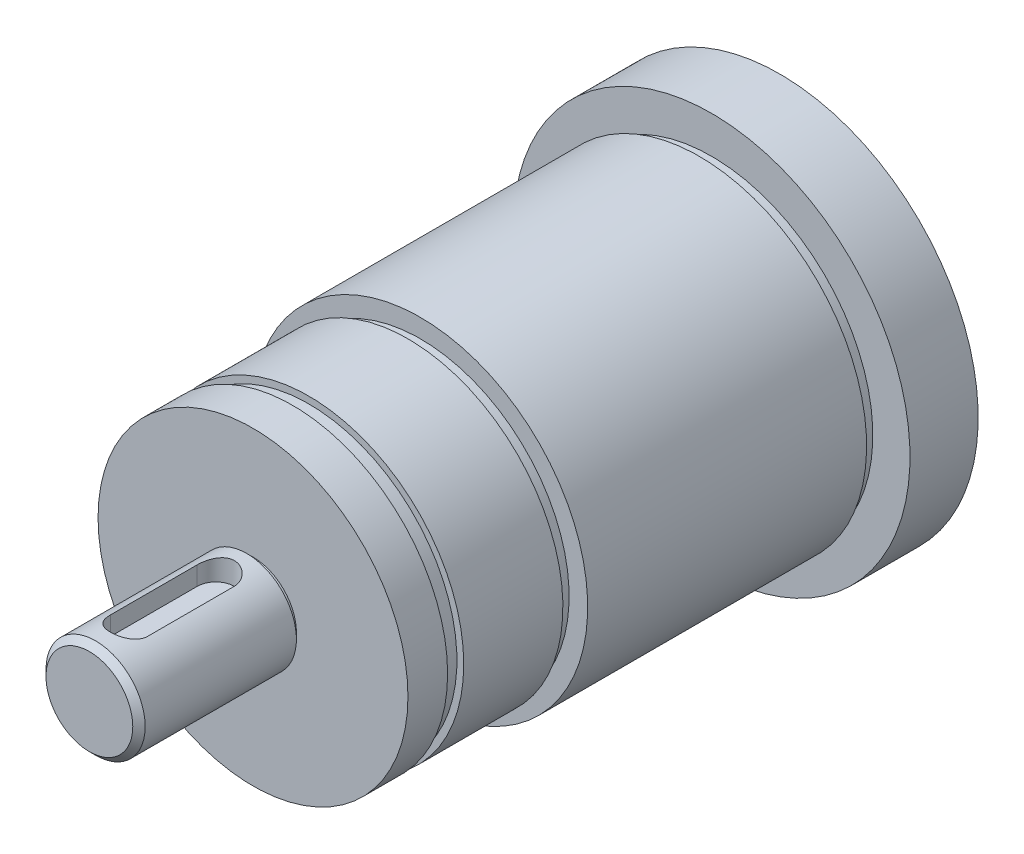
ISO-10303-21;
HEADER;
FILE_DESCRIPTION(('STEP AP214'),'2;1');
FILE_NAME('part.step','',(''),(''),'','','');
FILE_SCHEMA(('AUTOMOTIVE_DESIGN { 1 0 10303 214 1 1 1 1 }'));
ENDSEC;
DATA;
#1=APPLICATION_CONTEXT('core data for automotive mechanical design processes');
#2=APPLICATION_PROTOCOL_DEFINITION('international standard','automotive_design',2000,#1);
#3=PRODUCT_CONTEXT('',#1,'mechanical');
#4=PRODUCT('Part','Part','',(#3));
#5=PRODUCT_RELATED_PRODUCT_CATEGORY('part','',(#4));
#6=PRODUCT_DEFINITION_FORMATION('','',#4);
#7=PRODUCT_DEFINITION_CONTEXT('part definition',#1,'design');
#8=PRODUCT_DEFINITION('design','',#6,#7);
#9=PRODUCT_DEFINITION_SHAPE('','',#8);
#10=(LENGTH_UNIT() NAMED_UNIT(*) SI_UNIT(.MILLI.,.METRE.));
#11=(NAMED_UNIT(*) PLANE_ANGLE_UNIT() SI_UNIT($,.RADIAN.));
#12=(NAMED_UNIT(*) SI_UNIT($,.STERADIAN.) SOLID_ANGLE_UNIT());
#13=UNCERTAINTY_MEASURE_WITH_UNIT(LENGTH_MEASURE(1.E-05),#10,'distance_accuracy_value','');
#14=(GEOMETRIC_REPRESENTATION_CONTEXT(3) GLOBAL_UNCERTAINTY_ASSIGNED_CONTEXT((#13)) GLOBAL_UNIT_ASSIGNED_CONTEXT((#10,
#11,#12)) REPRESENTATION_CONTEXT('',''));
#15=CARTESIAN_POINT('',(0.,0.,0.));
#16=DIRECTION('',(0.,0.,1.));
#17=DIRECTION('',(1.,0.,0.));
#18=AXIS2_PLACEMENT_3D('',#15,#16,#17);
#19=CARTESIAN_POINT('',(0.,0.,0.));
#20=DIRECTION('',(0.,0.,-1.));
#21=DIRECTION('',(-1.,0.,0.));
#22=AXIS2_PLACEMENT_3D('',#19,#20,#21);
#23=CYLINDRICAL_SURFACE('',#22,12.5);
#24=CARTESIAN_POINT('',(0.,0.,38.));
#25=DIRECTION('',(0.,0.,-1.));
#26=DIRECTION('',(-1.,0.,0.));
#27=AXIS2_PLACEMENT_3D('',#24,#25,#26);
#28=CIRCLE('',#27,12.5);
#29=CARTESIAN_POINT('',(-12.5,0.,38.));
#30=VERTEX_POINT('',#29);
#31=EDGE_CURVE('E137',#30,#30,#28,.T.);
#32=ORIENTED_EDGE('',*,*,#31,.T.);
#33=EDGE_LOOP('',(#32));
#34=FACE_BOUND('',#33,.T.);
#35=CARTESIAN_POINT('',(0.,0.,30.));
#36=DIRECTION('',(0.,0.,1.));
#37=DIRECTION('',(0.,-1.,0.));
#38=AXIS2_PLACEMENT_3D('',#35,#36,#37);
#39=CIRCLE('',#38,12.5);
#40=CARTESIAN_POINT('',(0.,-12.5,30.));
#41=VERTEX_POINT('',#40);
#42=EDGE_CURVE('E288',#41,#41,#39,.T.);
#43=ORIENTED_EDGE('',*,*,#42,.T.);
#44=EDGE_LOOP('',(#43));
#45=FACE_BOUND('',#44,.T.);
#46=ADVANCED_FACE('F41',(#34,#45),#23,.T.);
#47=CARTESIAN_POINT('',(0.,0.,0.));
#48=DIRECTION('',(0.,0.,-1.));
#49=DIRECTION('',(-1.,0.,0.));
#50=AXIS2_PLACEMENT_3D('',#47,#48,#49);
#51=CYLINDRICAL_SURFACE('',#50,4.);
#52=CARTESIAN_POINT('',(1.5,3.70809924354783,45.5));
#53=CARTESIAN_POINT('',(1.50000149729856,3.70809443619347,45.4594074669704));
#54=CARTESIAN_POINT('',(1.49835118206537,3.70876663375751,45.4188360707122));
#55=CARTESIAN_POINT('',(1.49177905295192,3.71141673218274,45.3380154612727));
#56=CARTESIAN_POINT('',(1.48685833749724,3.7133941946446,45.2977661445068));
#57=CARTESIAN_POINT('',(1.46729482367934,3.72118975606221,45.1782327842748));
#58=CARTESIAN_POINT('',(1.44784998767983,3.72887188404209,45.0998003397728));
#59=CARTESIAN_POINT('',(1.39690233043372,3.74825217997877,44.9476324814849));
#60=CARTESIAN_POINT('',(1.36540966903062,3.7599469632381,44.8738931709592));
#61=CARTESIAN_POINT('',(1.29134097725473,3.7860238820009,44.7326664799387));
#62=CARTESIAN_POINT('',(1.24875587557702,3.80040821426565,44.6651842779876));
#63=CARTESIAN_POINT('',(1.15146603872016,3.83103589828726,44.5351080800593));
#64=CARTESIAN_POINT('',(1.09630269892843,3.84733374054252,44.4728699856818));
#65=CARTESIAN_POINT('',(0.976394584974248,3.8794978206844,44.3582764069826));
#66=CARTESIAN_POINT('',(0.911647960429693,3.8953639745168,44.3059228356596));
#67=CARTESIAN_POINT('',(0.771693719740028,3.92552893891844,44.2108597857464));
#68=CARTESIAN_POINT('',(0.69620496875862,3.93975598379754,44.1685393993163));
#69=CARTESIAN_POINT('',(0.538553622304916,3.96438035322527,44.0973480889171));
#70=CARTESIAN_POINT('',(0.456393528521798,3.97477910532575,44.0684721505131));
#71=CARTESIAN_POINT('',(0.291490050670581,3.99018690464435,44.0262422811784));
#72=CARTESIAN_POINT('',(0.208924649211902,3.99540906103972,44.012272615696));
#73=CARTESIAN_POINT('',(0.042465838580881,4.00064014015321,43.998278802068));
#74=CARTESIAN_POINT('',(-0.0414271540462172,4.00065066686691,43.9982503631981));
#75=CARTESIAN_POINT('',(-0.203744100069414,3.99559264174045,44.011781806229));
#76=CARTESIAN_POINT('',(-0.28223328288309,3.99077535168083,44.0246694752074));
#77=CARTESIAN_POINT('',(-0.435840275995121,3.97693262269583,44.0625362711122));
#78=CARTESIAN_POINT('',(-0.510957894586936,3.96790694481372,44.0875160846463));
#79=CARTESIAN_POINT('',(-0.656988917196582,3.94637770601049,44.1491703925958));
#80=CARTESIAN_POINT('',(-0.727825198012183,3.93382542785068,44.1860098409234));
#81=CARTESIAN_POINT('',(-0.862486444375069,3.90651314175191,44.2701920375731));
#82=CARTESIAN_POINT('',(-0.926309119580092,3.89175241632297,44.3175382017873));
#83=CARTESIAN_POINT('',(-1.04908600084313,3.86052643048222,44.4246231314911));
#84=CARTESIAN_POINT('',(-1.10753779261244,3.84401196825707,44.484924384335));
#85=CARTESIAN_POINT('',(-1.21369725159035,3.81182684214318,44.6145841343778));
#86=CARTESIAN_POINT('',(-1.26140069584828,3.79615651174147,44.6839461746474));
#87=CARTESIAN_POINT('',(-1.34567998313248,3.7671186794103,44.8317580284138));
#88=CARTESIAN_POINT('',(-1.38197861969245,3.75381153298453,44.9103784056676));
#89=CARTESIAN_POINT('',(-1.44059114536973,3.73171449181344,45.0732063218419));
#90=CARTESIAN_POINT('',(-1.46292853893353,3.72291700934123,45.157404204933));
#91=CARTESIAN_POINT('',(-1.48519272209728,3.7140622685257,45.2853810176478));
#92=CARTESIAN_POINT('',(-1.49074028414002,3.71183476402566,45.3281023295206));
#93=CARTESIAN_POINT('',(-1.49814308997677,3.70885093143241,45.4138740688717));
#94=CARTESIAN_POINT('',(-1.50000176547338,3.70809323601797,45.4569241530294));
#95=CARTESIAN_POINT('',(-1.5,3.70809924354783,45.5));
#96=B_SPLINE_CURVE_WITH_KNOTS('',3,(#52,#53,#54,#55,#56,#57,#58,#59,#60,#61,#62,#63,#64,#65,#66,
#67,#68,#69,#70,#71,#72,#73,#74,#75,#76,#77,#78,#79,#80,#81,#82,#83,#84,#85,#86,#87,#88,#89,#90,
#91,#92,#93,#94,#95),.UNSPECIFIED.,.F.,.F.,(4,2,2,2,2,2,2,2,2,2,2,2,2,2,2,2,2,2,2,2,2,4),(0.,
0.121697465666185,0.243354077586416,0.485593064591345,0.727628221922013,0.969861938431286,
1.22298027419407,1.47614754705134,1.73793539440997,1.9996255232324,2.25002925199202,
2.5003559133568,2.73829765644058,2.97625291175452,3.21767225141682,3.45917019544674,
3.7147799395163,3.97048993642582,4.23200510445914,4.4930788043249,4.62233004062783,
4.75146098044212),.UNSPECIFIED.);
#97=CARTESIAN_POINT('',(1.5,3.70809924354783,45.5));
#98=VERTEX_POINT('',#97);
#99=CARTESIAN_POINT('',(-1.5,3.70809924354783,45.5));
#100=VERTEX_POINT('',#99);
#101=EDGE_CURVE('E162',#98,#100,#96,.T.);
#102=ORIENTED_EDGE('',*,*,#101,.F.);
#103=DIRECTION('',(0.,0.,-1.));
#104=VECTOR('',#103,1.);
#105=CARTESIAN_POINT('',(1.5,3.70809924354783,0.));
#106=LINE('',#105,#104);
#107=CARTESIAN_POINT('',(1.5,3.70809924354783,52.5));
#108=VERTEX_POINT('',#107);
#109=EDGE_CURVE('E198',#108,#98,#106,.T.);
#110=ORIENTED_EDGE('',*,*,#109,.F.);
#111=CARTESIAN_POINT('',(-1.5,3.70809924354783,52.5));
#112=CARTESIAN_POINT('',(-1.50000149729856,3.70809443619347,52.5405925330296));
#113=CARTESIAN_POINT('',(-1.49835118206537,3.70876663375751,52.5811639292878));
#114=CARTESIAN_POINT('',(-1.49177905295192,3.71141673218274,52.6619845387273));
#115=CARTESIAN_POINT('',(-1.48685833749724,3.7133941946446,52.7022338554932));
#116=CARTESIAN_POINT('',(-1.46729482367934,3.72118975606221,52.8217672157252));
#117=CARTESIAN_POINT('',(-1.44784998767984,3.72887188404209,52.9001996602272));
#118=CARTESIAN_POINT('',(-1.39690233043372,3.74825217997877,53.0523675185151));
#119=CARTESIAN_POINT('',(-1.36540966903062,3.7599469632381,53.1261068290407));
#120=CARTESIAN_POINT('',(-1.29134097725473,3.7860238820009,53.2673335200613));
#121=CARTESIAN_POINT('',(-1.24875587557702,3.80040821426565,53.3348157220124));
#122=CARTESIAN_POINT('',(-1.15146603872016,3.83103589828726,53.4648919199407));
#123=CARTESIAN_POINT('',(-1.09630269892843,3.84733374054252,53.5271300143182));
#124=CARTESIAN_POINT('',(-0.976394584974256,3.8794978206844,53.6417235930174));
#125=CARTESIAN_POINT('',(-0.911647960429701,3.8953639745168,53.6940771643404));
#126=CARTESIAN_POINT('',(-0.771693719740036,3.92552893891844,53.7891402142536));
#127=CARTESIAN_POINT('',(-0.696204968758628,3.93975598379754,53.8314606006837));
#128=CARTESIAN_POINT('',(-0.538553622304924,3.96438035322527,53.9026519110829));
#129=CARTESIAN_POINT('',(-0.456393528521806,3.97477910532575,53.9315278494869));
#130=CARTESIAN_POINT('',(-0.291490050670589,3.99018690464435,53.9737577188216));
#131=CARTESIAN_POINT('',(-0.20892464921191,3.99540906103972,53.987727384304));
#132=CARTESIAN_POINT('',(-0.0424658385808886,4.00064014015321,54.001721197932));
#133=CARTESIAN_POINT('',(0.0414271540462096,4.00065066686691,54.0017496368019));
#134=CARTESIAN_POINT('',(0.203744100069407,3.99559264174045,53.988218193771));
#135=CARTESIAN_POINT('',(0.282233282883083,3.99077535168083,53.9753305247926));
#136=CARTESIAN_POINT('',(0.435840275995115,3.97693262269583,53.9374637288878));
#137=CARTESIAN_POINT('',(0.51095789458693,3.96790694481372,53.9124839153537));
#138=CARTESIAN_POINT('',(0.656988917196577,3.94637770601049,53.8508296074042));
#139=CARTESIAN_POINT('',(0.727825198012178,3.93382542785068,53.8139901590766));
#140=CARTESIAN_POINT('',(0.862486444375064,3.90651314175191,53.7298079624269));
#141=CARTESIAN_POINT('',(0.926309119580087,3.89175241632297,53.6824617982127));
#142=CARTESIAN_POINT('',(1.04908600084313,3.86052643048222,53.5753768685089));
#143=CARTESIAN_POINT('',(1.10753779261244,3.84401196825707,53.515075615665));
#144=CARTESIAN_POINT('',(1.21369725159035,3.81182684214318,53.3854158656222));
#145=CARTESIAN_POINT('',(1.26140069584828,3.79615651174147,53.3160538253526));
#146=CARTESIAN_POINT('',(1.34567998313248,3.7671186794103,53.1682419715862));
#147=CARTESIAN_POINT('',(1.38197861969246,3.75381153298453,53.0896215943324));
#148=CARTESIAN_POINT('',(1.44059114536973,3.73171449181344,52.9267936781581));
#149=CARTESIAN_POINT('',(1.46292853893353,3.72291700934123,52.842595795067));
#150=CARTESIAN_POINT('',(1.48519272209728,3.7140622685257,52.7146189823522));
#151=CARTESIAN_POINT('',(1.49074028414002,3.71183476402566,52.6718976704794));
#152=CARTESIAN_POINT('',(1.49814308997677,3.70885093143241,52.5861259311283));
#153=CARTESIAN_POINT('',(1.50000176547338,3.70809323601797,52.5430758469706));
#154=CARTESIAN_POINT('',(1.5,3.70809924354783,52.5));
#155=B_SPLINE_CURVE_WITH_KNOTS('',3,(#111,#112,#113,#114,#115,#116,#117,#118,#119,#120,#121,
#122,#123,#124,#125,#126,#127,#128,#129,#130,#131,#132,#133,#134,#135,#136,#137,#138,#139,#140,
#141,#142,#143,#144,#145,#146,#147,#148,#149,#150,#151,#152,#153,#154),.UNSPECIFIED.,.F.,.F.,(4,
2,2,2,2,2,2,2,2,2,2,2,2,2,2,2,2,2,2,2,2,4),(0.,0.121697465666185,0.243354077586416,
0.485593064591345,0.72762822192202,0.969861938431285,1.22298027419407,1.47614754705134,
1.73793539440997,1.9996255232324,2.25002925199202,2.5003559133568,2.73829765644058,
2.97625291175452,3.21767225141682,3.45917019544673,3.7147799395163,3.97048993642583,
4.23200510445916,4.49307880432491,4.62233004062784,4.75146098044213),.UNSPECIFIED.);
#156=CARTESIAN_POINT('',(-1.5,3.70809924354783,52.5));
#157=VERTEX_POINT('',#156);
#158=EDGE_CURVE('E64',#157,#108,#155,.T.);
#159=ORIENTED_EDGE('',*,*,#158,.F.);
#160=DIRECTION('',(0.,0.,-1.));
#161=VECTOR('',#160,1.);
#162=CARTESIAN_POINT('',(-1.5,3.70809924354783,0.));
#163=LINE('',#162,#161);
#164=EDGE_CURVE('E173',#100,#157,#163,.F.);
#165=ORIENTED_EDGE('',*,*,#164,.F.);
#166=EDGE_LOOP('',(#102,#110,#159,#165));
#167=FACE_BOUND('',#166,.T.);
#168=CARTESIAN_POINT('',(0.,0.,55.2));
#169=DIRECTION('',(0.,0.,1.));
#170=DIRECTION('',(1.,0.,0.));
#171=AXIS2_PLACEMENT_3D('',#168,#169,#170);
#172=CIRCLE('',#171,4.);
#173=CARTESIAN_POINT('',(4.,0.,55.2));
#174=VERTEX_POINT('',#173);
#175=EDGE_CURVE('E160',#174,#174,#172,.F.);
#176=ORIENTED_EDGE('',*,*,#175,.T.);
#177=EDGE_LOOP('',(#176));
#178=FACE_BOUND('',#177,.T.);
#179=CARTESIAN_POINT('',(0.,0.,43.));
#180=DIRECTION('',(0.,0.,-1.));
#181=DIRECTION('',(-1.,0.,0.));
#182=AXIS2_PLACEMENT_3D('',#179,#180,#181);
#183=CIRCLE('',#182,4.);
#184=CARTESIAN_POINT('',(-4.,0.,43.));
#185=VERTEX_POINT('',#184);
#186=EDGE_CURVE('E111',#185,#185,#183,.T.);
#187=ORIENTED_EDGE('',*,*,#186,.F.);
#188=EDGE_LOOP('',(#187));
#189=FACE_BOUND('',#188,.T.);
#190=CARTESIAN_POINT('',(0.,-4.,51.95));
#191=CARTESIAN_POINT('',(-0.0684391851745466,-3.99999965877989,51.9500004465876));
#192=CARTESIAN_POINT('',(-0.13688305250286,-3.9982269498484,51.9556392269444));
#193=CARTESIAN_POINT('',(-0.271769209588449,-3.99132894088806,51.9779862415392));
#194=CARTESIAN_POINT('',(-0.338211042725907,-3.98620288199859,51.9946969813644));
#195=CARTESIAN_POINT('',(-0.467128543650807,-3.97315815697909,52.0385693711957));
#196=CARTESIAN_POINT('',(-0.529610176985804,-3.96524381499025,52.065714844653));
#197=CARTESIAN_POINT('',(-0.64913480234646,-3.94743969161092,52.1296173176783));
#198=CARTESIAN_POINT('',(-0.706176935444886,-3.93754959899905,52.1663758317806));
#199=CARTESIAN_POINT('',(-0.814965334952282,-3.91650213740282,52.2496559920174));
#200=CARTESIAN_POINT('',(-0.866520028156661,-3.90531715926988,52.2964208850611));
#201=CARTESIAN_POINT('',(-0.961197382036994,-3.88310046374208,52.3978683924135));
#202=CARTESIAN_POINT('',(-1.0043184728987,-3.87206877523457,52.4525524774945));
#203=CARTESIAN_POINT('',(-1.08194336483113,-3.85111144698172,52.5699445638081));
#204=CARTESIAN_POINT('',(-1.11620784150129,-3.84121988301795,52.6328174775272));
#205=CARTESIAN_POINT('',(-1.17359741076671,-3.82407801799234,52.7637923149819));
#206=CARTESIAN_POINT('',(-1.19672543771945,-3.81682702128688,52.8318928557939));
#207=CARTESIAN_POINT('',(-1.23048459930034,-3.806076069845,52.9692280774521));
#208=CARTESIAN_POINT('',(-1.24147110007865,-3.80246972929508,53.0383668436389));
#209=CARTESIAN_POINT('',(-1.25174555036988,-3.7991005514095,53.1775931189119));
#210=CARTESIAN_POINT('',(-1.25103660995772,-3.79933669227334,53.2476803708217));
#211=CARTESIAN_POINT('',(-1.23821824732739,-3.80353189075438,53.383874460269));
#212=CARTESIAN_POINT('',(-1.22656057869383,-3.80734341745948,53.4500291258616));
#213=CARTESIAN_POINT('',(-1.19290813355626,-3.81802025652489,53.5793921565374));
#214=CARTESIAN_POINT('',(-1.17091225844551,-3.82488589343114,53.6426002077088));
#215=CARTESIAN_POINT('',(-1.11688874681277,-3.84101044014296,53.7653519444326));
#216=CARTESIAN_POINT('',(-1.08471925662082,-3.85030284660824,53.824828610692));
#217=CARTESIAN_POINT('',(-1.01136020737848,-3.87021856580069,53.9376877678791));
#218=CARTESIAN_POINT('',(-0.970168305215773,-3.88084222394551,53.9910686702537));
#219=CARTESIAN_POINT('',(-0.877716954182126,-3.90281527800493,54.092774943417));
#220=CARTESIAN_POINT('',(-0.826084570592821,-3.91417569605695,54.1407595577797));
#221=CARTESIAN_POINT('',(-0.715364408095535,-3.9359157075958,54.2274718935797));
#222=CARTESIAN_POINT('',(-0.656276077349023,-3.94629522838372,54.2661989292192));
#223=CARTESIAN_POINT('',(-0.531664610465455,-3.96501294890191,54.3335276886013));
#224=CARTESIAN_POINT('',(-0.466094906919279,-3.97333460648208,54.362048135464));
#225=CARTESIAN_POINT('',(-0.330767977782643,-3.98687955828554,54.4075530008516));
#226=CARTESIAN_POINT('',(-0.261012030724607,-3.99210379325151,54.4245409222384));
#227=CARTESIAN_POINT('',(-0.122185157290343,-3.99871389395014,54.445918042579));
#228=CARTESIAN_POINT('',(-0.0531918487888409,-4.00024022895439,54.4507685435935));
#229=CARTESIAN_POINT('',(0.0846303057325862,-3.9996979973098,54.4490337733627));
#230=CARTESIAN_POINT('',(0.153459174306507,-3.99762995581124,54.4424501726774));
#231=CARTESIAN_POINT('',(0.287219332975853,-3.99022363769771,54.4184044073936));
#232=CARTESIAN_POINT('',(0.352204978420949,-3.98496793110724,54.4012167323875));
#233=CARTESIAN_POINT('',(0.478351928861366,-3.97180121379252,54.3567856476333));
#234=CARTESIAN_POINT('',(0.539512760449017,-3.96388987514203,54.3295409959751));
#235=CARTESIAN_POINT('',(0.657932406672232,-3.94598542759567,54.2650267834512));
#236=CARTESIAN_POINT('',(0.715059739787954,-3.93594626818209,54.2275290125028));
#237=CARTESIAN_POINT('',(0.822365850960095,-3.91493410002887,54.143846789883));
#238=CARTESIAN_POINT('',(0.872542738043336,-3.90396083845861,54.0976599822569));
#239=CARTESIAN_POINT('',(0.966587462919657,-3.88176994885247,53.9957411099463));
#240=CARTESIAN_POINT('',(1.01012652339774,-3.87055986714445,53.9397033362547));
#241=CARTESIAN_POINT('',(1.08721250244909,-3.84961947087601,53.8208733836293));
#242=CARTESIAN_POINT('',(1.12075957972524,-3.83988913281399,53.7580813119956));
#243=CARTESIAN_POINT('',(1.17670083481141,-3.82311782360753,53.6276548271141));
#244=CARTESIAN_POINT('',(1.19913819558886,-3.81606646468026,53.5600403504953));
#245=CARTESIAN_POINT('',(1.23222894320964,-3.80551170941212,53.4217275066762));
#246=CARTESIAN_POINT('',(1.2428868141461,-3.80200696302675,53.3510303236287));
#247=CARTESIAN_POINT('',(1.2517940615754,-3.79908292712494,53.2119959124458));
#248=CARTESIAN_POINT('',(1.25058279621957,-3.79948604683076,53.1436965461871));
#249=CARTESIAN_POINT('',(1.23708818129474,-3.80390090472382,53.0083254150808));
#250=CARTESIAN_POINT('',(1.22480534822559,-3.80791247457319,52.941253593116));
#251=CARTESIAN_POINT('',(1.18987729913378,-3.81896814158112,52.8112059603982));
#252=CARTESIAN_POINT('',(1.16738642405944,-3.82596698183474,52.748184558904));
#253=CARTESIAN_POINT('',(1.11280227335064,-3.84219704261347,52.6267595864686));
#254=CARTESIAN_POINT('',(1.08070704444254,-3.85142871716521,52.5683569579223));
#255=CARTESIAN_POINT('',(1.00635675013475,-3.8715348703158,52.4553540295594));
#256=CARTESIAN_POINT('',(0.963753335241274,-3.88245948922441,52.4009918704996));
#257=CARTESIAN_POINT('',(0.870208996404849,-3.90448998821726,52.3000136718882));
#258=CARTESIAN_POINT('',(0.819265842344404,-3.91559591606794,52.253399711009));
#259=CARTESIAN_POINT('',(0.708486662823334,-3.93717271952328,52.167717461637));
#260=CARTESIAN_POINT('',(0.648414574487382,-3.94761101730634,52.12894526355));
#261=CARTESIAN_POINT('',(0.522279138013657,-3.96626769296916,52.0621010848606));
#262=CARTESIAN_POINT('',(0.456218157795453,-3.97448694315832,52.0340248978582));
#263=CARTESIAN_POINT('',(0.325747635373981,-3.98720650733461,51.9914086323915));
#264=CARTESIAN_POINT('',(0.261670337112548,-3.99196240806139,51.9759251326947));
#265=CARTESIAN_POINT('',(0.131729895440248,-3.99835900340486,51.9552216400323));
#266=CARTESIAN_POINT('',(0.0658671161396752,-4.00000032839643,51.949999570196));
#267=CARTESIAN_POINT('',(0.,-4.,51.95));
#268=B_SPLINE_CURVE_WITH_KNOTS('',3,(#190,#191,#192,#193,#194,#195,#196,#197,#198,#199,#200,
#201,#202,#203,#204,#205,#206,#207,#208,#209,#210,#211,#212,#213,#214,#215,#216,#217,#218,#219,
#220,#221,#222,#223,#224,#225,#226,#227,#228,#229,#230,#231,#232,#233,#234,#235,#236,#237,#238,
#239,#240,#241,#242,#243,#244,#245,#246,#247,#248,#249,#250,#251,#252,#253,#254,#255,#256,#257,
#258,#259,#260,#261,#262,#263,#264,#265,#266,#267),.UNSPECIFIED.,.T.,.F.,(4,2,2,2,2,2,2,2,2,2,2,
2,2,2,2,2,2,2,2,2,2,2,2,2,2,2,2,2,2,2,2,2,2,2,2,2,2,2,4),(0.,0.20507544943251,0.410197323349067,
0.615002479202438,0.819839921558392,1.03037822195158,1.24095567431276,1.45673771247493,
1.67246286279527,1.88169150167211,2.09086450295139,2.2917691742217,2.49269519979063,
2.69655642720546,2.90047066010359,3.113667472796,3.32688007413303,3.54175460689771,
3.75656384494554,3.96307568548238,4.16955735649363,4.37090626722872,4.572280050345,
4.77856324738343,4.98490245709259,5.19941778713141,5.41392970983713,5.62760115751033,
5.84119123892431,6.04512203476054,6.24904331751085,6.44997913396672,6.65095584330175,
6.85979514006362,7.06869037373341,7.28440668126413,7.50003806666338,7.69744636651542,
7.89481470763049),.UNSPECIFIED.);
#269=CARTESIAN_POINT('',(0.,-4.,51.95));
#270=VERTEX_POINT('',#269);
#271=EDGE_CURVE('E196',#270,#270,#268,.T.);
#272=ORIENTED_EDGE('',*,*,#271,.T.);
#273=EDGE_LOOP('',(#272));
#274=FACE_BOUND('',#273,.T.);
#275=ADVANCED_FACE('F171',(#167,#178,#189,#274),#51,.T.);
#276=CARTESIAN_POINT('',(0.,12.5,38.));
#277=DIRECTION('',(0.,0.,1.));
#278=DIRECTION('',(1.,0.,0.));
#279=AXIS2_PLACEMENT_3D('',#276,#277,#278);
#280=PLANE('',#279);
#281=CARTESIAN_POINT('',(0.,0.,38.));
#282=DIRECTION('',(0.,0.,-1.));
#283=DIRECTION('',(-1.,0.,0.));
#284=AXIS2_PLACEMENT_3D('',#281,#282,#283);
#285=CIRCLE('',#284,11.95);
#286=CARTESIAN_POINT('',(-11.95,0.,38.));
#287=VERTEX_POINT('',#286);
#288=EDGE_CURVE('E136',#287,#287,#285,.T.);
#289=ORIENTED_EDGE('',*,*,#288,.T.);
#290=EDGE_LOOP('',(#289));
#291=FACE_BOUND('',#290,.T.);
#292=ORIENTED_EDGE('',*,*,#31,.F.);
#293=EDGE_LOOP('',(#292));
#294=FACE_BOUND('',#293,.T.);
#295=ADVANCED_FACE('F231',(#291,#294),#280,.T.);
#296=CARTESIAN_POINT('',(0.,0.,0.));
#297=DIRECTION('',(0.,0.,-1.));
#298=DIRECTION('',(-1.,0.,0.));
#299=AXIS2_PLACEMENT_3D('',#296,#297,#298);
#300=CYLINDRICAL_SURFACE('',#299,11.95);
#301=CARTESIAN_POINT('',(0.,0.,39.3));
#302=DIRECTION('',(0.,0.,-1.));
#303=DIRECTION('',(-1.,0.,0.));
#304=AXIS2_PLACEMENT_3D('',#301,#302,#303);
#305=CIRCLE('',#304,11.95);
#306=CARTESIAN_POINT('',(-11.95,0.,39.3));
#307=VERTEX_POINT('',#306);
#308=EDGE_CURVE('E131',#307,#307,#305,.T.);
#309=ORIENTED_EDGE('',*,*,#308,.T.);
#310=EDGE_LOOP('',(#309));
#311=FACE_BOUND('',#310,.T.);
#312=ORIENTED_EDGE('',*,*,#288,.F.);
#313=EDGE_LOOP('',(#312));
#314=FACE_BOUND('',#313,.T.);
#315=ADVANCED_FACE('F355',(#311,#314),#300,.T.);
#316=CARTESIAN_POINT('',(0.,11.95,39.3));
#317=DIRECTION('',(0.,0.,-1.));
#318=DIRECTION('',(-1.,0.,0.));
#319=AXIS2_PLACEMENT_3D('',#316,#317,#318);
#320=PLANE('',#319);
#321=CARTESIAN_POINT('',(0.,0.,39.3));
#322=DIRECTION('',(0.,0.,-1.));
#323=DIRECTION('',(-1.,0.,0.));
#324=AXIS2_PLACEMENT_3D('',#321,#322,#323);
#325=CIRCLE('',#324,12.5);
#326=CARTESIAN_POINT('',(-12.5,0.,39.3));
#327=VERTEX_POINT('',#326);
#328=EDGE_CURVE('E128',#327,#327,#325,.T.);
#329=ORIENTED_EDGE('',*,*,#328,.T.);
#330=EDGE_LOOP('',(#329));
#331=FACE_BOUND('',#330,.T.);
#332=ORIENTED_EDGE('',*,*,#308,.F.);
#333=EDGE_LOOP('',(#332));
#334=FACE_BOUND('',#333,.T.);
#335=ADVANCED_FACE('F363',(#331,#334),#320,.T.);
#336=CARTESIAN_POINT('',(0.,0.,0.));
#337=DIRECTION('',(0.,0.,-1.));
#338=DIRECTION('',(-1.,0.,0.));
#339=AXIS2_PLACEMENT_3D('',#336,#337,#338);
#340=CYLINDRICAL_SURFACE('',#339,12.5);
#341=CARTESIAN_POINT('',(0.,0.,42.5));
#342=DIRECTION('',(0.,0.,-1.));
#343=DIRECTION('',(-1.,0.,0.));
#344=AXIS2_PLACEMENT_3D('',#341,#342,#343);
#345=CIRCLE('',#344,12.5);
#346=CARTESIAN_POINT('',(-12.5,0.,42.5));
#347=VERTEX_POINT('',#346);
#348=EDGE_CURVE('E130',#347,#347,#345,.T.);
#349=ORIENTED_EDGE('',*,*,#348,.T.);
#350=EDGE_LOOP('',(#349));
#351=FACE_BOUND('',#350,.T.);
#352=ORIENTED_EDGE('',*,*,#328,.F.);
#353=EDGE_LOOP('',(#352));
#354=FACE_BOUND('',#353,.T.);
#355=ADVANCED_FACE('F367',(#351,#354),#340,.T.);
#356=CARTESIAN_POINT('',(0.,12.5,42.5));
#357=DIRECTION('',(0.,0.,1.));
#358=DIRECTION('',(1.,0.,0.));
#359=AXIS2_PLACEMENT_3D('',#356,#357,#358);
#360=PLANE('',#359);
#361=CARTESIAN_POINT('',(0.,0.,42.5));
#362=DIRECTION('',(0.,0.,-1.));
#363=DIRECTION('',(-1.,0.,0.));
#364=AXIS2_PLACEMENT_3D('',#361,#362,#363);
#365=CIRCLE('',#364,3.5);
#366=CARTESIAN_POINT('',(-3.5,0.,42.5));
#367=VERTEX_POINT('',#366);
#368=EDGE_CURVE('E122',#367,#367,#365,.T.);
#369=ORIENTED_EDGE('',*,*,#368,.T.);
#370=EDGE_LOOP('',(#369));
#371=FACE_BOUND('',#370,.T.);
#372=ORIENTED_EDGE('',*,*,#348,.F.);
#373=EDGE_LOOP('',(#372));
#374=FACE_BOUND('',#373,.T.);
#375=ADVANCED_FACE('F379',(#371,#374),#360,.T.);
#376=CARTESIAN_POINT('',(0.,0.,0.));
#377=DIRECTION('',(0.,0.,-1.));
#378=DIRECTION('',(-1.,0.,0.));
#379=AXIS2_PLACEMENT_3D('',#376,#377,#378);
#380=CYLINDRICAL_SURFACE('',#379,3.5);
#381=CARTESIAN_POINT('',(0.,0.,43.));
#382=DIRECTION('',(0.,0.,-1.));
#383=DIRECTION('',(-1.,0.,0.));
#384=AXIS2_PLACEMENT_3D('',#381,#382,#383);
#385=CIRCLE('',#384,3.5);
#386=CARTESIAN_POINT('',(-3.5,0.,43.));
#387=VERTEX_POINT('',#386);
#388=EDGE_CURVE('E121',#387,#387,#385,.T.);
#389=ORIENTED_EDGE('',*,*,#388,.T.);
#390=EDGE_LOOP('',(#389));
#391=FACE_BOUND('',#390,.T.);
#392=ORIENTED_EDGE('',*,*,#368,.F.);
#393=EDGE_LOOP('',(#392));
#394=FACE_BOUND('',#393,.T.);
#395=ADVANCED_FACE('F388',(#391,#394),#380,.T.);
#396=CARTESIAN_POINT('',(0.,3.5,43.));
#397=DIRECTION('',(0.,0.,-1.));
#398=DIRECTION('',(-1.,0.,0.));
#399=AXIS2_PLACEMENT_3D('',#396,#397,#398);
#400=PLANE('',#399);
#401=ORIENTED_EDGE('',*,*,#186,.T.);
#402=EDGE_LOOP('',(#401));
#403=FACE_BOUND('',#402,.T.);
#404=ORIENTED_EDGE('',*,*,#388,.F.);
#405=EDGE_LOOP('',(#404));
#406=FACE_BOUND('',#405,.T.);
#407=ADVANCED_FACE('F275',(#403,#406),#400,.T.);
#408=CARTESIAN_POINT('',(0.,4.,55.7));
#409=DIRECTION('',(0.,0.,1.));
#410=DIRECTION('',(1.,0.,0.));
#411=AXIS2_PLACEMENT_3D('',#408,#409,#410);
#412=PLANE('',#411);
#413=CARTESIAN_POINT('',(0.,0.,55.7));
#414=DIRECTION('',(0.,0.,1.));
#415=DIRECTION('',(1.,0.,0.));
#416=AXIS2_PLACEMENT_3D('',#413,#414,#415);
#417=CIRCLE('',#416,3.50000000000001);
#418=CARTESIAN_POINT('',(3.50000000000001,0.,55.7));
#419=VERTEX_POINT('',#418);
#420=EDGE_CURVE('E159',#419,#419,#417,.T.);
#421=ORIENTED_EDGE('',*,*,#420,.T.);
#422=EDGE_LOOP('',(#421));
#423=FACE_BOUND('',#422,.T.);
#424=ADVANCED_FACE('F187',(#423),#412,.T.);
#425=CARTESIAN_POINT('',(0.,0.,55.2));
#426=DIRECTION('',(0.,0.,-1.));
#427=DIRECTION('',(-1.,0.,0.));
#428=AXIS2_PLACEMENT_3D('',#425,#426,#427);
#429=CONICAL_SURFACE('',#428,4.,0.785398163397448);
#430=ORIENTED_EDGE('',*,*,#420,.F.);
#431=EDGE_LOOP('',(#430));
#432=FACE_BOUND('',#431,.T.);
#433=ORIENTED_EDGE('',*,*,#175,.F.);
#434=EDGE_LOOP('',(#433));
#435=FACE_BOUND('',#434,.T.);
#436=ADVANCED_FACE('F189',(#432,#435),#429,.T.);
#437=CARTESIAN_POINT('',(0.,2.2,52.5));
#438=DIRECTION('',(0.,1.,0.));
#439=DIRECTION('',(0.,0.,1.));
#440=AXIS2_PLACEMENT_3D('',#437,#438,#439);
#441=CYLINDRICAL_SURFACE('',#440,1.5);
#442=DIRECTION('',(0.,1.,0.));
#443=VECTOR('',#442,1.);
#444=CARTESIAN_POINT('',(-1.5,2.2,52.5));
#445=LINE('',#444,#443);
#446=CARTESIAN_POINT('',(-1.5,2.2,52.5));
#447=VERTEX_POINT('',#446);
#448=EDGE_CURVE('E115',#447,#157,#445,.T.);
#449=ORIENTED_EDGE('',*,*,#448,.T.);
#450=ORIENTED_EDGE('',*,*,#158,.T.);
#451=DIRECTION('',(0.,1.,0.));
#452=VECTOR('',#451,1.);
#453=CARTESIAN_POINT('',(1.5,2.2,52.5));
#454=LINE('',#453,#452);
#455=CARTESIAN_POINT('',(1.5,2.2,52.5));
#456=VERTEX_POINT('',#455);
#457=EDGE_CURVE('E60',#456,#108,#454,.T.);
#458=ORIENTED_EDGE('',*,*,#457,.F.);
#459=CARTESIAN_POINT('',(0.,2.2,52.5));
#460=DIRECTION('',(0.,1.,0.));
#461=DIRECTION('',(0.,0.,1.));
#462=AXIS2_PLACEMENT_3D('',#459,#460,#461);
#463=CIRCLE('',#462,1.5);
#464=EDGE_CURVE('E87',#447,#456,#463,.T.);
#465=ORIENTED_EDGE('',*,*,#464,.F.);
#466=EDGE_LOOP('',(#449,#450,#458,#465));
#467=FACE_BOUND('',#466,.T.);
#468=ADVANCED_FACE('F84',(#467),#441,.F.);
#469=CARTESIAN_POINT('',(-1.5,2.2,52.5));
#470=DIRECTION('',(-1.,0.,0.));
#471=DIRECTION('',(0.,0.,1.));
#472=AXIS2_PLACEMENT_3D('',#469,#470,#471);
#473=PLANE('',#472);
#474=ORIENTED_EDGE('',*,*,#164,.T.);
#475=ORIENTED_EDGE('',*,*,#448,.F.);
#476=DIRECTION('',(0.,0.,1.));
#477=VECTOR('',#476,1.);
#478=CARTESIAN_POINT('',(-1.5,2.2,52.5));
#479=LINE('',#478,#477);
#480=CARTESIAN_POINT('',(-1.5,2.2,45.5));
#481=VERTEX_POINT('',#480);
#482=EDGE_CURVE('E89',#481,#447,#479,.T.);
#483=ORIENTED_EDGE('',*,*,#482,.F.);
#484=DIRECTION('',(0.,1.,0.));
#485=VECTOR('',#484,1.);
#486=CARTESIAN_POINT('',(-1.5,2.2,45.5));
#487=LINE('',#486,#485);
#488=EDGE_CURVE('E113',#481,#100,#487,.T.);
#489=ORIENTED_EDGE('',*,*,#488,.T.);
#490=EDGE_LOOP('',(#474,#475,#483,#489));
#491=FACE_BOUND('',#490,.T.);
#492=ADVANCED_FACE('F185',(#491),#473,.F.);
#493=CARTESIAN_POINT('',(0.,2.2,45.5));
#494=DIRECTION('',(0.,1.,0.));
#495=DIRECTION('',(0.,0.,1.));
#496=AXIS2_PLACEMENT_3D('',#493,#494,#495);
#497=CYLINDRICAL_SURFACE('',#496,1.5);
#498=DIRECTION('',(0.,1.,0.));
#499=VECTOR('',#498,1.);
#500=CARTESIAN_POINT('',(1.5,2.2,45.5));
#501=LINE('',#500,#499);
#502=CARTESIAN_POINT('',(1.5,2.2,45.5));
#503=VERTEX_POINT('',#502);
#504=EDGE_CURVE('E90',#503,#98,#501,.T.);
#505=ORIENTED_EDGE('',*,*,#504,.T.);
#506=ORIENTED_EDGE('',*,*,#101,.T.);
#507=ORIENTED_EDGE('',*,*,#488,.F.);
#508=CARTESIAN_POINT('',(0.,2.2,45.5));
#509=DIRECTION('',(0.,1.,0.));
#510=DIRECTION('',(0.,0.,1.));
#511=AXIS2_PLACEMENT_3D('',#508,#509,#510);
#512=CIRCLE('',#511,1.5);
#513=EDGE_CURVE('E97',#503,#481,#512,.T.);
#514=ORIENTED_EDGE('',*,*,#513,.F.);
#515=EDGE_LOOP('',(#505,#506,#507,#514));
#516=FACE_BOUND('',#515,.T.);
#517=ADVANCED_FACE('F180',(#516),#497,.F.);
#518=CARTESIAN_POINT('',(1.5,2.2,52.5));
#519=DIRECTION('',(1.,0.,0.));
#520=DIRECTION('',(0.,0.,-1.));
#521=AXIS2_PLACEMENT_3D('',#518,#519,#520);
#522=PLANE('',#521);
#523=ORIENTED_EDGE('',*,*,#109,.T.);
#524=ORIENTED_EDGE('',*,*,#504,.F.);
#525=DIRECTION('',(0.,0.,-1.));
#526=VECTOR('',#525,1.);
#527=CARTESIAN_POINT('',(1.5,2.2,52.5));
#528=LINE('',#527,#526);
#529=EDGE_CURVE('E91',#456,#503,#528,.T.);
#530=ORIENTED_EDGE('',*,*,#529,.F.);
#531=ORIENTED_EDGE('',*,*,#457,.T.);
#532=EDGE_LOOP('',(#523,#524,#530,#531));
#533=FACE_BOUND('',#532,.T.);
#534=ADVANCED_FACE('F94',(#533),#522,.F.);
#535=CARTESIAN_POINT('',(0.,2.2,52.5));
#536=DIRECTION('',(0.,1.,0.));
#537=DIRECTION('',(0.,0.,1.));
#538=AXIS2_PLACEMENT_3D('',#535,#536,#537);
#539=PLANE('',#538);
#540=ORIENTED_EDGE('',*,*,#464,.T.);
#541=ORIENTED_EDGE('',*,*,#529,.T.);
#542=ORIENTED_EDGE('',*,*,#513,.T.);
#543=ORIENTED_EDGE('',*,*,#482,.T.);
#544=EDGE_LOOP('',(#540,#541,#542,#543));
#545=FACE_BOUND('',#544,.T.);
#546=ADVANCED_FACE('F101',(#545),#539,.T.);
#547=CARTESIAN_POINT('',(0.,-4.,53.2));
#548=DIRECTION('',(0.,-1.,0.));
#549=DIRECTION('',(0.,0.,-1.));
#550=AXIS2_PLACEMENT_3D('',#547,#548,#549);
#551=CYLINDRICAL_SURFACE('',#550,1.25);
#552=ORIENTED_EDGE('',*,*,#271,.F.);
#553=EDGE_LOOP('',(#552));
#554=FACE_BOUND('',#553,.T.);
#555=CARTESIAN_POINT('',(0.,-3.7,53.2));
#556=DIRECTION('',(0.,-1.,0.));
#557=DIRECTION('',(0.,0.,-1.));
#558=AXIS2_PLACEMENT_3D('',#555,#556,#557);
#559=CIRCLE('',#558,1.25);
#560=CARTESIAN_POINT('',(0.,-3.7,51.95));
#561=VERTEX_POINT('',#560);
#562=EDGE_CURVE('E106',#561,#561,#559,.T.);
#563=ORIENTED_EDGE('',*,*,#562,.F.);
#564=EDGE_LOOP('',(#563));
#565=FACE_BOUND('',#564,.T.);
#566=ADVANCED_FACE('F204',(#554,#565),#551,.F.);
#567=CARTESIAN_POINT('',(0.,-3.7,54.45));
#568=DIRECTION('',(0.,-1.,0.));
#569=DIRECTION('',(0.,0.,-1.));
#570=AXIS2_PLACEMENT_3D('',#567,#568,#569);
#571=PLANE('',#570);
#572=ORIENTED_EDGE('',*,*,#562,.T.);
#573=EDGE_LOOP('',(#572));
#574=FACE_BOUND('',#573,.T.);
#575=ADVANCED_FACE('F207',(#574),#571,.T.);
#576=CARTESIAN_POINT('',(0.,12.5,30.));
#577=DIRECTION('',(0.,0.,-1.));
#578=DIRECTION('',(0.,1.,0.));
#579=AXIS2_PLACEMENT_3D('',#576,#577,#578);
#580=PLANE('',#579);
#581=CARTESIAN_POINT('',(0.,0.,30.));
#582=DIRECTION('',(0.,0.,1.));
#583=DIRECTION('',(0.,-1.,0.));
#584=AXIS2_PLACEMENT_3D('',#581,#582,#583);
#585=CIRCLE('',#584,12.);
#586=CARTESIAN_POINT('',(0.,-12.,30.));
#587=VERTEX_POINT('',#586);
#588=EDGE_CURVE('E286',#587,#587,#585,.T.);
#589=ORIENTED_EDGE('',*,*,#588,.T.);
#590=EDGE_LOOP('',(#589));
#591=FACE_BOUND('',#590,.T.);
#592=ORIENTED_EDGE('',*,*,#42,.F.);
#593=EDGE_LOOP('',(#592));
#594=FACE_BOUND('',#593,.T.);
#595=ADVANCED_FACE('F250',(#591,#594),#580,.T.);
#596=CARTESIAN_POINT('',(0.,0.,0.));
#597=DIRECTION('',(0.,0.,-1.));
#598=DIRECTION('',(-1.,0.,0.));
#599=AXIS2_PLACEMENT_3D('',#596,#597,#598);
#600=CYLINDRICAL_SURFACE('',#599,13.5);
#601=CARTESIAN_POINT('',(0.,0.,29.));
#602=DIRECTION('',(0.,0.,-1.));
#603=DIRECTION('',(-1.,0.,0.));
#604=AXIS2_PLACEMENT_3D('',#601,#602,#603);
#605=CIRCLE('',#604,13.5);
#606=CARTESIAN_POINT('',(-13.5,0.,29.));
#607=VERTEX_POINT('',#606);
#608=EDGE_CURVE('E144',#607,#607,#605,.T.);
#609=ORIENTED_EDGE('',*,*,#608,.T.);
#610=EDGE_LOOP('',(#609));
#611=FACE_BOUND('',#610,.T.);
#612=CARTESIAN_POINT('',(0.,0.,6.5));
#613=DIRECTION('',(0.,0.,1.));
#614=DIRECTION('',(0.,-1.,0.));
#615=AXIS2_PLACEMENT_3D('',#612,#613,#614);
#616=CIRCLE('',#615,13.5);
#617=CARTESIAN_POINT('',(0.,-13.5,6.5));
#618=VERTEX_POINT('',#617);
#619=EDGE_CURVE('E294',#618,#618,#616,.T.);
#620=ORIENTED_EDGE('',*,*,#619,.T.);
#621=EDGE_LOOP('',(#620));
#622=FACE_BOUND('',#621,.T.);
#623=ADVANCED_FACE('F241',(#611,#622),#600,.T.);
#624=CARTESIAN_POINT('',(0.,13.5,29.));
#625=DIRECTION('',(0.,0.,1.));
#626=DIRECTION('',(1.,0.,0.));
#627=AXIS2_PLACEMENT_3D('',#624,#625,#626);
#628=PLANE('',#627);
#629=CARTESIAN_POINT('',(0.,0.,29.));
#630=DIRECTION('',(0.,0.,-1.));
#631=DIRECTION('',(-1.,0.,0.));
#632=AXIS2_PLACEMENT_3D('',#629,#630,#631);
#633=CIRCLE('',#632,12.);
#634=CARTESIAN_POINT('',(-12.,0.,29.));
#635=VERTEX_POINT('',#634);
#636=EDGE_CURVE('E142',#635,#635,#633,.T.);
#637=ORIENTED_EDGE('',*,*,#636,.T.);
#638=EDGE_LOOP('',(#637));
#639=FACE_BOUND('',#638,.T.);
#640=ORIENTED_EDGE('',*,*,#608,.F.);
#641=EDGE_LOOP('',(#640));
#642=FACE_BOUND('',#641,.T.);
#643=ADVANCED_FACE('F239',(#639,#642),#628,.T.);
#644=CARTESIAN_POINT('',(0.,0.,0.));
#645=DIRECTION('',(0.,0.,-1.));
#646=DIRECTION('',(-1.,0.,0.));
#647=AXIS2_PLACEMENT_3D('',#644,#645,#646);
#648=CYLINDRICAL_SURFACE('',#647,12.);
#649=ORIENTED_EDGE('',*,*,#636,.F.);
#650=EDGE_LOOP('',(#649));
#651=FACE_BOUND('',#650,.T.);
#652=ORIENTED_EDGE('',*,*,#588,.F.);
#653=EDGE_LOOP('',(#652));
#654=FACE_BOUND('',#653,.T.);
#655=ADVANCED_FACE('F237',(#651,#654),#648,.T.);
#656=CARTESIAN_POINT('',(0.,13.5,6.5));
#657=DIRECTION('',(0.,0.,-1.));
#658=DIRECTION('',(0.,1.,0.));
#659=AXIS2_PLACEMENT_3D('',#656,#657,#658);
#660=PLANE('',#659);
#661=CARTESIAN_POINT('',(0.,0.,6.5));
#662=DIRECTION('',(0.,0.,1.));
#663=DIRECTION('',(0.,-1.,0.));
#664=AXIS2_PLACEMENT_3D('',#661,#662,#663);
#665=CIRCLE('',#664,13.);
#666=CARTESIAN_POINT('',(0.,-13.,6.5));
#667=VERTEX_POINT('',#666);
#668=EDGE_CURVE('E292',#667,#667,#665,.T.);
#669=ORIENTED_EDGE('',*,*,#668,.T.);
#670=EDGE_LOOP('',(#669));
#671=FACE_BOUND('',#670,.T.);
#672=ORIENTED_EDGE('',*,*,#619,.F.);
#673=EDGE_LOOP('',(#672));
#674=FACE_BOUND('',#673,.T.);
#675=ADVANCED_FACE('F216',(#671,#674),#660,.T.);
#676=CARTESIAN_POINT('',(0.,0.,2.));
#677=DIRECTION('',(0.,0.,-1.));
#678=DIRECTION('',(-1.,0.,0.));
#679=AXIS2_PLACEMENT_3D('',#676,#677,#678);
#680=PLANE('',#679);
#681=CARTESIAN_POINT('',(0.,0.,2.));
#682=DIRECTION('',(0.,0.,-1.));
#683=DIRECTION('',(-1.,0.,0.));
#684=AXIS2_PLACEMENT_3D('',#681,#682,#683);
#685=CIRCLE('',#684,3.);
#686=CARTESIAN_POINT('',(-3.,0.,2.));
#687=VERTEX_POINT('',#686);
#688=EDGE_CURVE('E103',#687,#687,#685,.T.);
#689=ORIENTED_EDGE('',*,*,#688,.T.);
#690=EDGE_LOOP('',(#689));
#691=FACE_BOUND('',#690,.T.);
#692=ADVANCED_FACE('F215',(#691),#680,.T.);
#693=CARTESIAN_POINT('',(0.,0.,2.));
#694=DIRECTION('',(0.,0.,-1.));
#695=DIRECTION('',(-1.,0.,0.));
#696=AXIS2_PLACEMENT_3D('',#693,#694,#695);
#697=CYLINDRICAL_SURFACE('',#696,3.);
#698=CARTESIAN_POINT('',(0.,0.,0.499999999999993));
#699=DIRECTION('',(0.,0.,-1.));
#700=DIRECTION('',(-1.,0.,0.));
#701=AXIS2_PLACEMENT_3D('',#698,#699,#700);
#702=CIRCLE('',#701,3.);
#703=CARTESIAN_POINT('',(-3.,0.,0.499999999999993));
#704=VERTEX_POINT('',#703);
#705=EDGE_CURVE('E49',#704,#704,#702,.T.);
#706=ORIENTED_EDGE('',*,*,#705,.T.);
#707=EDGE_LOOP('',(#706));
#708=FACE_BOUND('',#707,.T.);
#709=ORIENTED_EDGE('',*,*,#688,.F.);
#710=EDGE_LOOP('',(#709));
#711=FACE_BOUND('',#710,.T.);
#712=ADVANCED_FACE('F214',(#708,#711),#697,.F.);
#713=CARTESIAN_POINT('',(0.,0.,0.499999999999993));
#714=DIRECTION('',(0.,0.,-1.));
#715=DIRECTION('',(-1.,0.,0.));
#716=AXIS2_PLACEMENT_3D('',#713,#714,#715);
#717=CONICAL_SURFACE('',#716,3.,0.785398163397445);
#718=CARTESIAN_POINT('',(0.,0.,0.));
#719=DIRECTION('',(0.,0.,-1.));
#720=DIRECTION('',(-1.,0.,0.));
#721=AXIS2_PLACEMENT_3D('',#718,#719,#720);
#722=CIRCLE('',#721,3.49999999999999);
#723=CARTESIAN_POINT('',(-3.49999999999999,0.,0.));
#724=VERTEX_POINT('',#723);
#725=EDGE_CURVE('E11',#724,#724,#722,.F.);
#726=ORIENTED_EDGE('',*,*,#725,.F.);
#727=EDGE_LOOP('',(#726));
#728=FACE_BOUND('',#727,.T.);
#729=ORIENTED_EDGE('',*,*,#705,.F.);
#730=EDGE_LOOP('',(#729));
#731=FACE_BOUND('',#730,.T.);
#732=ADVANCED_FACE('F42',(#728,#731),#717,.F.);
#733=CARTESIAN_POINT('',(0.,0.,0.));
#734=DIRECTION('',(0.,0.,-1.));
#735=DIRECTION('',(-1.,0.,0.));
#736=AXIS2_PLACEMENT_3D('',#733,#734,#735);
#737=PLANE('',#736);
#738=ORIENTED_EDGE('',*,*,#725,.T.);
#739=EDGE_LOOP('',(#738));
#740=FACE_BOUND('',#739,.T.);
#741=CARTESIAN_POINT('',(0.,0.,0.));
#742=DIRECTION('',(0.,0.,-1.));
#743=DIRECTION('',(-1.,0.,0.));
#744=AXIS2_PLACEMENT_3D('',#741,#742,#743);
#745=CIRCLE('',#744,16.);
#746=CARTESIAN_POINT('',(-16.,0.,0.));
#747=VERTEX_POINT('',#746);
#748=EDGE_CURVE('E152',#747,#747,#745,.T.);
#749=ORIENTED_EDGE('',*,*,#748,.T.);
#750=EDGE_LOOP('',(#749));
#751=FACE_BOUND('',#750,.T.);
#752=ADVANCED_FACE('F257',(#740,#751),#737,.T.);
#753=CARTESIAN_POINT('',(0.,0.,0.));
#754=DIRECTION('',(0.,0.,-1.));
#755=DIRECTION('',(-1.,0.,0.));
#756=AXIS2_PLACEMENT_3D('',#753,#754,#755);
#757=CYLINDRICAL_SURFACE('',#756,16.);
#758=CARTESIAN_POINT('',(0.,0.,5.5));
#759=DIRECTION('',(0.,0.,-1.));
#760=DIRECTION('',(-1.,0.,0.));
#761=AXIS2_PLACEMENT_3D('',#758,#759,#760);
#762=CIRCLE('',#761,16.);
#763=CARTESIAN_POINT('',(-16.,0.,5.5));
#764=VERTEX_POINT('',#763);
#765=EDGE_CURVE('E151',#764,#764,#762,.T.);
#766=ORIENTED_EDGE('',*,*,#765,.T.);
#767=EDGE_LOOP('',(#766));
#768=FACE_BOUND('',#767,.T.);
#769=ORIENTED_EDGE('',*,*,#748,.F.);
#770=EDGE_LOOP('',(#769));
#771=FACE_BOUND('',#770,.T.);
#772=ADVANCED_FACE('F258',(#768,#771),#757,.T.);
#773=CARTESIAN_POINT('',(0.,16.,5.5));
#774=DIRECTION('',(0.,0.,1.));
#775=DIRECTION('',(1.,0.,0.));
#776=AXIS2_PLACEMENT_3D('',#773,#774,#775);
#777=PLANE('',#776);
#778=CARTESIAN_POINT('',(0.,0.,5.5));
#779=DIRECTION('',(0.,0.,-1.));
#780=DIRECTION('',(-1.,0.,0.));
#781=AXIS2_PLACEMENT_3D('',#778,#779,#780);
#782=CIRCLE('',#781,13.);
#783=CARTESIAN_POINT('',(-13.,0.,5.5));
#784=VERTEX_POINT('',#783);
#785=EDGE_CURVE('E146',#784,#784,#782,.T.);
#786=ORIENTED_EDGE('',*,*,#785,.T.);
#787=EDGE_LOOP('',(#786));
#788=FACE_BOUND('',#787,.T.);
#789=ORIENTED_EDGE('',*,*,#765,.F.);
#790=EDGE_LOOP('',(#789));
#791=FACE_BOUND('',#790,.T.);
#792=ADVANCED_FACE('F252',(#788,#791),#777,.T.);
#793=CARTESIAN_POINT('',(0.,0.,0.));
#794=DIRECTION('',(0.,0.,-1.));
#795=DIRECTION('',(-1.,0.,0.));
#796=AXIS2_PLACEMENT_3D('',#793,#794,#795);
#797=CYLINDRICAL_SURFACE('',#796,13.);
#798=ORIENTED_EDGE('',*,*,#785,.F.);
#799=EDGE_LOOP('',(#798));
#800=FACE_BOUND('',#799,.T.);
#801=ORIENTED_EDGE('',*,*,#668,.F.);
#802=EDGE_LOOP('',(#801));
#803=FACE_BOUND('',#802,.T.);
#804=ADVANCED_FACE('F247',(#800,#803),#797,.T.);
#805=CLOSED_SHELL('',(#46,#275,#295,#315,#335,#355,#375,#395,#407,#424,#436,#468,#492,#517,#534,
#546,#566,#575,#595,#623,#643,#655,#675,#692,#712,#732,#752,#772,#792,#804));
#806=MANIFOLD_SOLID_BREP('B2',#805);
#807=ADVANCED_BREP_SHAPE_REPRESENTATION('',(#18,#806),#14);
#808=SHAPE_DEFINITION_REPRESENTATION(#9,#807);
ENDSEC;
END-ISO-10303-21;
